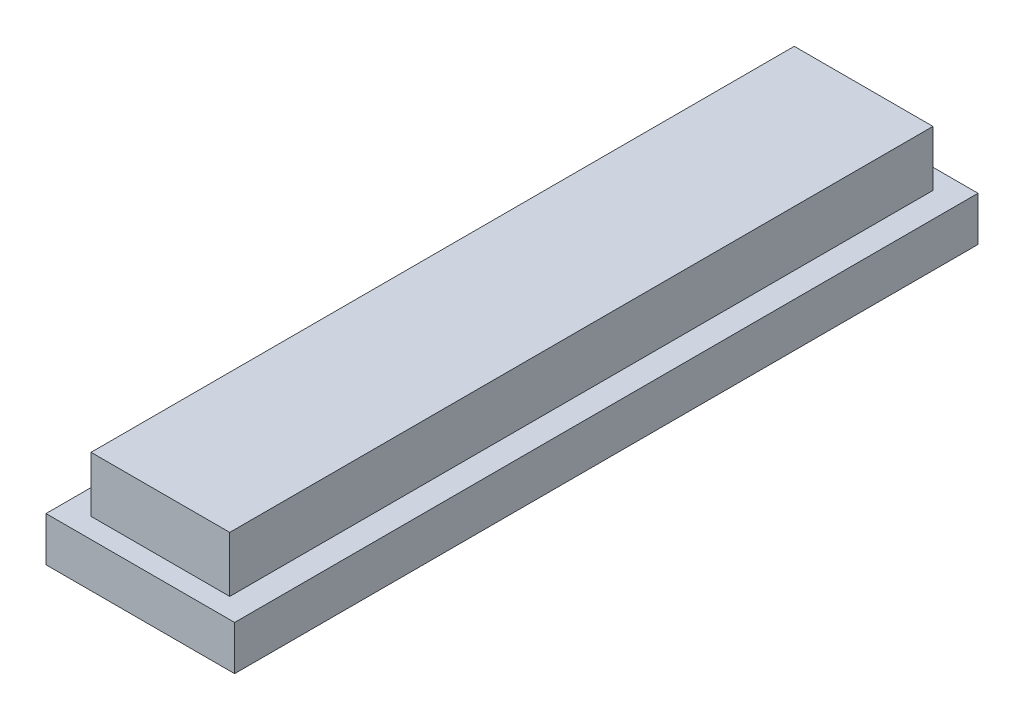
ISO-10303-21;
HEADER;
FILE_DESCRIPTION(('STEP AP214'),'2;1');
FILE_NAME('part.step','',(''),(''),'','','');
FILE_SCHEMA(('AUTOMOTIVE_DESIGN { 1 0 10303 214 1 1 1 1 }'));
ENDSEC;
DATA;
#1=APPLICATION_CONTEXT('core data for automotive mechanical design processes');
#2=APPLICATION_PROTOCOL_DEFINITION('international standard','automotive_design',2000,#1);
#3=PRODUCT_CONTEXT('',#1,'mechanical');
#4=PRODUCT('Part','Part','',(#3));
#5=PRODUCT_RELATED_PRODUCT_CATEGORY('part','',(#4));
#6=PRODUCT_DEFINITION_FORMATION('','',#4);
#7=PRODUCT_DEFINITION_CONTEXT('part definition',#1,'design');
#8=PRODUCT_DEFINITION('design','',#6,#7);
#9=PRODUCT_DEFINITION_SHAPE('','',#8);
#10=(LENGTH_UNIT() NAMED_UNIT(*) SI_UNIT(.MILLI.,.METRE.));
#11=(NAMED_UNIT(*) PLANE_ANGLE_UNIT() SI_UNIT($,.RADIAN.));
#12=(NAMED_UNIT(*) SI_UNIT($,.STERADIAN.) SOLID_ANGLE_UNIT());
#13=UNCERTAINTY_MEASURE_WITH_UNIT(LENGTH_MEASURE(1.E-05),#10,'distance_accuracy_value','');
#14=(GEOMETRIC_REPRESENTATION_CONTEXT(3) GLOBAL_UNCERTAINTY_ASSIGNED_CONTEXT((#13)) GLOBAL_UNIT_ASSIGNED_CONTEXT((#10,
#11,#12)) REPRESENTATION_CONTEXT('',''));
#15=CARTESIAN_POINT('',(0.,0.,0.));
#16=DIRECTION('',(0.,0.,1.));
#17=DIRECTION('',(1.,0.,0.));
#18=AXIS2_PLACEMENT_3D('',#15,#16,#17);
#19=CARTESIAN_POINT('',(0.,4.,0.));
#20=DIRECTION('',(0.,-1.,0.));
#21=DIRECTION('',(0.,0.,-1.));
#22=AXIS2_PLACEMENT_3D('',#19,#20,#21);
#23=PLANE('',#22);
#24=DIRECTION('',(0.,0.,1.));
#25=VECTOR('',#24,1.);
#26=CARTESIAN_POINT('',(-8.5,4.,-33.5));
#27=LINE('',#26,#25);
#28=CARTESIAN_POINT('',(-8.5,4.,-33.5));
#29=VERTEX_POINT('',#28);
#30=CARTESIAN_POINT('',(-8.49999999999999,4.,33.5));
#31=VERTEX_POINT('',#30);
#32=EDGE_CURVE('E141',#29,#31,#27,.T.);
#33=ORIENTED_EDGE('',*,*,#32,.T.);
#34=DIRECTION('',(1.,0.,0.));
#35=VECTOR('',#34,1.);
#36=CARTESIAN_POINT('',(8.50000000000001,4.,33.5));
#37=LINE('',#36,#35);
#38=CARTESIAN_POINT('',(8.50000000000001,4.,33.5));
#39=VERTEX_POINT('',#38);
#40=EDGE_CURVE('E145',#31,#39,#37,.T.);
#41=ORIENTED_EDGE('',*,*,#40,.T.);
#42=DIRECTION('',(0.,0.,-1.));
#43=VECTOR('',#42,1.);
#44=CARTESIAN_POINT('',(8.5,4.,-33.5));
#45=LINE('',#44,#43);
#46=CARTESIAN_POINT('',(8.5,4.,-33.5));
#47=VERTEX_POINT('',#46);
#48=EDGE_CURVE('E149',#39,#47,#45,.T.);
#49=ORIENTED_EDGE('',*,*,#48,.T.);
#50=DIRECTION('',(-1.,0.,0.));
#51=VECTOR('',#50,1.);
#52=CARTESIAN_POINT('',(8.5,4.,-33.5));
#53=LINE('',#52,#51);
#54=EDGE_CURVE('E152',#47,#29,#53,.T.);
#55=ORIENTED_EDGE('',*,*,#54,.T.);
#56=EDGE_LOOP('',(#33,#41,#49,#55));
#57=FACE_BOUND('',#56,.T.);
#58=DIRECTION('',(0.,0.,1.));
#59=VECTOR('',#58,1.);
#60=CARTESIAN_POINT('',(-6.25,4.,-31.69));
#61=LINE('',#60,#59);
#62=CARTESIAN_POINT('',(-6.25,4.,-31.69));
#63=VERTEX_POINT('',#62);
#64=CARTESIAN_POINT('',(-6.25,4.,31.69));
#65=VERTEX_POINT('',#64);
#66=EDGE_CURVE('E57',#63,#65,#61,.T.);
#67=ORIENTED_EDGE('',*,*,#66,.F.);
#68=DIRECTION('',(-1.,0.,0.));
#69=VECTOR('',#68,1.);
#70=CARTESIAN_POINT('',(6.25,4.,-31.69));
#71=LINE('',#70,#69);
#72=CARTESIAN_POINT('',(6.25,4.,-31.69));
#73=VERTEX_POINT('',#72);
#74=EDGE_CURVE('E61',#73,#63,#71,.T.);
#75=ORIENTED_EDGE('',*,*,#74,.F.);
#76=DIRECTION('',(0.,0.,-1.));
#77=VECTOR('',#76,1.);
#78=CARTESIAN_POINT('',(6.25,4.,-31.69));
#79=LINE('',#78,#77);
#80=CARTESIAN_POINT('',(6.25,4.,31.69));
#81=VERTEX_POINT('',#80);
#82=EDGE_CURVE('E226',#81,#73,#79,.T.);
#83=ORIENTED_EDGE('',*,*,#82,.F.);
#84=DIRECTION('',(1.,0.,0.));
#85=VECTOR('',#84,1.);
#86=CARTESIAN_POINT('',(6.25,4.,31.69));
#87=LINE('',#86,#85);
#88=EDGE_CURVE('E223',#65,#81,#87,.T.);
#89=ORIENTED_EDGE('',*,*,#88,.F.);
#90=EDGE_LOOP('',(#67,#75,#83,#89));
#91=FACE_BOUND('',#90,.T.);
#92=ADVANCED_FACE('F39',(#57,#91),#23,.F.);
#93=CARTESIAN_POINT('',(-8.5,4.,-33.5));
#94=DIRECTION('',(1.,0.,0.));
#95=DIRECTION('',(0.,0.,-1.));
#96=AXIS2_PLACEMENT_3D('',#93,#94,#95);
#97=PLANE('',#96);
#98=DIRECTION('',(0.,0.,1.));
#99=VECTOR('',#98,1.);
#100=CARTESIAN_POINT('',(-8.5,0.,-33.5));
#101=LINE('',#100,#99);
#102=CARTESIAN_POINT('',(-8.5,0.,-33.5));
#103=VERTEX_POINT('',#102);
#104=CARTESIAN_POINT('',(-8.49999999999999,0.,33.5));
#105=VERTEX_POINT('',#104);
#106=EDGE_CURVE('E130',#103,#105,#101,.T.);
#107=ORIENTED_EDGE('',*,*,#106,.T.);
#108=DIRECTION('',(0.,-1.,0.));
#109=VECTOR('',#108,1.);
#110=CARTESIAN_POINT('',(-8.49999999999999,4.,33.5));
#111=LINE('',#110,#109);
#112=EDGE_CURVE('E11',#31,#105,#111,.T.);
#113=ORIENTED_EDGE('',*,*,#112,.F.);
#114=ORIENTED_EDGE('',*,*,#32,.F.);
#115=DIRECTION('',(0.,-1.,0.));
#116=VECTOR('',#115,1.);
#117=CARTESIAN_POINT('',(-8.5,4.,-33.5));
#118=LINE('',#117,#116);
#119=EDGE_CURVE('E154',#29,#103,#118,.T.);
#120=ORIENTED_EDGE('',*,*,#119,.T.);
#121=EDGE_LOOP('',(#107,#113,#114,#120));
#122=FACE_BOUND('',#121,.T.);
#123=ADVANCED_FACE('F41',(#122),#97,.F.);
#124=CARTESIAN_POINT('',(8.50000000000001,4.,33.5));
#125=DIRECTION('',(0.,0.,-1.));
#126=DIRECTION('',(-1.,0.,0.));
#127=AXIS2_PLACEMENT_3D('',#124,#125,#126);
#128=PLANE('',#127);
#129=DIRECTION('',(1.,0.,0.));
#130=VECTOR('',#129,1.);
#131=CARTESIAN_POINT('',(8.50000000000001,0.,33.5));
#132=LINE('',#131,#130);
#133=CARTESIAN_POINT('',(8.50000000000001,0.,33.5));
#134=VERTEX_POINT('',#133);
#135=EDGE_CURVE('E135',#105,#134,#132,.T.);
#136=ORIENTED_EDGE('',*,*,#135,.T.);
#137=DIRECTION('',(0.,-1.,0.));
#138=VECTOR('',#137,1.);
#139=CARTESIAN_POINT('',(8.50000000000001,4.,33.5));
#140=LINE('',#139,#138);
#141=EDGE_CURVE('E49',#39,#134,#140,.T.);
#142=ORIENTED_EDGE('',*,*,#141,.F.);
#143=ORIENTED_EDGE('',*,*,#40,.F.);
#144=ORIENTED_EDGE('',*,*,#112,.T.);
#145=EDGE_LOOP('',(#136,#142,#143,#144));
#146=FACE_BOUND('',#145,.T.);
#147=ADVANCED_FACE('F245',(#146),#128,.F.);
#148=CARTESIAN_POINT('',(8.5,4.,-33.5));
#149=DIRECTION('',(-1.,0.,0.));
#150=DIRECTION('',(0.,0.,1.));
#151=AXIS2_PLACEMENT_3D('',#148,#149,#150);
#152=PLANE('',#151);
#153=DIRECTION('',(0.,0.,-1.));
#154=VECTOR('',#153,1.);
#155=CARTESIAN_POINT('',(8.5,0.,-33.5));
#156=LINE('',#155,#154);
#157=CARTESIAN_POINT('',(8.5,0.,-33.5));
#158=VERTEX_POINT('',#157);
#159=EDGE_CURVE('E158',#134,#158,#156,.T.);
#160=ORIENTED_EDGE('',*,*,#159,.T.);
#161=DIRECTION('',(0.,-1.,0.));
#162=VECTOR('',#161,1.);
#163=CARTESIAN_POINT('',(8.5,4.,-33.5));
#164=LINE('',#163,#162);
#165=EDGE_CURVE('E166',#47,#158,#164,.T.);
#166=ORIENTED_EDGE('',*,*,#165,.F.);
#167=ORIENTED_EDGE('',*,*,#48,.F.);
#168=ORIENTED_EDGE('',*,*,#141,.T.);
#169=EDGE_LOOP('',(#160,#166,#167,#168));
#170=FACE_BOUND('',#169,.T.);
#171=ADVANCED_FACE('F257',(#170),#152,.F.);
#172=CARTESIAN_POINT('',(8.5,4.,-33.5));
#173=DIRECTION('',(0.,0.,1.));
#174=DIRECTION('',(1.,0.,0.));
#175=AXIS2_PLACEMENT_3D('',#172,#173,#174);
#176=PLANE('',#175);
#177=DIRECTION('',(-1.,0.,0.));
#178=VECTOR('',#177,1.);
#179=CARTESIAN_POINT('',(8.5,0.,-33.5));
#180=LINE('',#179,#178);
#181=EDGE_CURVE('E146',#158,#103,#180,.T.);
#182=ORIENTED_EDGE('',*,*,#181,.T.);
#183=ORIENTED_EDGE('',*,*,#119,.F.);
#184=ORIENTED_EDGE('',*,*,#54,.F.);
#185=ORIENTED_EDGE('',*,*,#165,.T.);
#186=EDGE_LOOP('',(#182,#183,#184,#185));
#187=FACE_BOUND('',#186,.T.);
#188=ADVANCED_FACE('F253',(#187),#176,.F.);
#189=CARTESIAN_POINT('',(0.,0.,0.));
#190=DIRECTION('',(0.,-1.,0.));
#191=DIRECTION('',(0.,0.,-1.));
#192=AXIS2_PLACEMENT_3D('',#189,#190,#191);
#193=PLANE('',#192);
#194=CARTESIAN_POINT('',(0.000544501566562177,0.,-25.9999999942984));
#195=DIRECTION('',(0.,-1.,0.));
#196=DIRECTION('',(0.,0.,-1.));
#197=AXIS2_PLACEMENT_3D('',#194,#195,#196);
#198=CIRCLE('',#197,3.45);
#199=CARTESIAN_POINT('',(0.000544501566562177,0.,-29.4499999942984));
#200=VERTEX_POINT('',#199);
#201=EDGE_CURVE('E192',#200,#200,#198,.T.);
#202=ORIENTED_EDGE('',*,*,#201,.F.);
#203=EDGE_LOOP('',(#202));
#204=FACE_BOUND('',#203,.T.);
#205=CARTESIAN_POINT('',(0.000272250783281088,0.,-12.9999999971492));
#206=DIRECTION('',(0.,-1.,0.));
#207=DIRECTION('',(0.,0.,-1.));
#208=AXIS2_PLACEMENT_3D('',#205,#206,#207);
#209=CIRCLE('',#208,3.45);
#210=CARTESIAN_POINT('',(0.000272250783281088,0.,-16.4499999971492));
#211=VERTEX_POINT('',#210);
#212=EDGE_CURVE('E203',#211,#211,#209,.T.);
#213=ORIENTED_EDGE('',*,*,#212,.F.);
#214=EDGE_LOOP('',(#213));
#215=FACE_BOUND('',#214,.T.);
#216=CARTESIAN_POINT('',(0.273629758933262,0.,25.9985600900324));
#217=DIRECTION('',(0.,-1.,0.));
#218=DIRECTION('',(0.,0.,-1.));
#219=AXIS2_PLACEMENT_3D('',#216,#217,#218);
#220=CIRCLE('',#219,3.45);
#221=CARTESIAN_POINT('',(0.273629758933262,0.,22.5485600900324));
#222=VERTEX_POINT('',#221);
#223=EDGE_CURVE('E569',#222,#222,#220,.T.);
#224=ORIENTED_EDGE('',*,*,#223,.F.);
#225=EDGE_LOOP('',(#224));
#226=FACE_BOUND('',#225,.T.);
#227=CARTESIAN_POINT('',(0.136814879466631,0.,12.9992800450162));
#228=DIRECTION('',(0.,-1.,0.));
#229=DIRECTION('',(0.,0.,-1.));
#230=AXIS2_PLACEMENT_3D('',#227,#228,#229);
#231=CIRCLE('',#230,3.45);
#232=CARTESIAN_POINT('',(0.136814879466631,0.,9.54928004501621));
#233=VERTEX_POINT('',#232);
#234=EDGE_CURVE('E561',#233,#233,#231,.T.);
#235=ORIENTED_EDGE('',*,*,#234,.F.);
#236=EDGE_LOOP('',(#235));
#237=FACE_BOUND('',#236,.T.);
#238=CARTESIAN_POINT('',(0.,0.,0.));
#239=DIRECTION('',(0.,-1.,0.));
#240=DIRECTION('',(0.,0.,-1.));
#241=AXIS2_PLACEMENT_3D('',#238,#239,#240);
#242=CIRCLE('',#241,3.45);
#243=CARTESIAN_POINT('',(0.,0.,-3.45));
#244=VERTEX_POINT('',#243);
#245=EDGE_CURVE('E211',#244,#244,#242,.T.);
#246=ORIENTED_EDGE('',*,*,#245,.F.);
#247=EDGE_LOOP('',(#246));
#248=FACE_BOUND('',#247,.T.);
#249=ORIENTED_EDGE('',*,*,#106,.F.);
#250=ORIENTED_EDGE('',*,*,#181,.F.);
#251=ORIENTED_EDGE('',*,*,#159,.F.);
#252=ORIENTED_EDGE('',*,*,#135,.F.);
#253=EDGE_LOOP('',(#249,#250,#251,#252));
#254=FACE_BOUND('',#253,.T.);
#255=ADVANCED_FACE('F250',(#204,#215,#226,#237,#248,#254),#193,.T.);
#256=CARTESIAN_POINT('',(-6.25,9.,-31.69));
#257=DIRECTION('',(1.,0.,0.));
#258=DIRECTION('',(0.,0.,-1.));
#259=AXIS2_PLACEMENT_3D('',#256,#257,#258);
#260=PLANE('',#259);
#261=ORIENTED_EDGE('',*,*,#66,.T.);
#262=DIRECTION('',(0.,-1.,0.));
#263=VECTOR('',#262,1.);
#264=CARTESIAN_POINT('',(-6.25,9.,31.69));
#265=LINE('',#264,#263);
#266=CARTESIAN_POINT('',(-6.25,9.,31.69));
#267=VERTEX_POINT('',#266);
#268=EDGE_CURVE('E110',#267,#65,#265,.T.);
#269=ORIENTED_EDGE('',*,*,#268,.F.);
#270=DIRECTION('',(0.,0.,1.));
#271=VECTOR('',#270,1.);
#272=CARTESIAN_POINT('',(-6.25,9.,-31.69));
#273=LINE('',#272,#271);
#274=CARTESIAN_POINT('',(-6.25,9.,-31.69));
#275=VERTEX_POINT('',#274);
#276=EDGE_CURVE('E117',#275,#267,#273,.T.);
#277=ORIENTED_EDGE('',*,*,#276,.F.);
#278=DIRECTION('',(0.,-1.,0.));
#279=VECTOR('',#278,1.);
#280=CARTESIAN_POINT('',(-6.25,9.,-31.69));
#281=LINE('',#280,#279);
#282=EDGE_CURVE('E220',#275,#63,#281,.T.);
#283=ORIENTED_EDGE('',*,*,#282,.T.);
#284=EDGE_LOOP('',(#261,#269,#277,#283));
#285=FACE_BOUND('',#284,.T.);
#286=ADVANCED_FACE('F128',(#285),#260,.F.);
#287=CARTESIAN_POINT('',(6.25,9.,31.69));
#288=DIRECTION('',(0.,0.,-1.));
#289=DIRECTION('',(-1.,0.,0.));
#290=AXIS2_PLACEMENT_3D('',#287,#288,#289);
#291=PLANE('',#290);
#292=ORIENTED_EDGE('',*,*,#88,.T.);
#293=DIRECTION('',(0.,-1.,0.));
#294=VECTOR('',#293,1.);
#295=CARTESIAN_POINT('',(6.25,9.,31.69));
#296=LINE('',#295,#294);
#297=CARTESIAN_POINT('',(6.25,9.,31.69));
#298=VERTEX_POINT('',#297);
#299=EDGE_CURVE('E112',#298,#81,#296,.T.);
#300=ORIENTED_EDGE('',*,*,#299,.F.);
#301=DIRECTION('',(1.,0.,0.));
#302=VECTOR('',#301,1.);
#303=CARTESIAN_POINT('',(6.25,9.,31.69));
#304=LINE('',#303,#302);
#305=EDGE_CURVE('E105',#267,#298,#304,.T.);
#306=ORIENTED_EDGE('',*,*,#305,.F.);
#307=ORIENTED_EDGE('',*,*,#268,.T.);
#308=EDGE_LOOP('',(#292,#300,#306,#307));
#309=FACE_BOUND('',#308,.T.);
#310=ADVANCED_FACE('F108',(#309),#291,.F.);
#311=CARTESIAN_POINT('',(6.25,9.,-31.69));
#312=DIRECTION('',(-1.,0.,0.));
#313=DIRECTION('',(0.,0.,1.));
#314=AXIS2_PLACEMENT_3D('',#311,#312,#313);
#315=PLANE('',#314);
#316=ORIENTED_EDGE('',*,*,#82,.T.);
#317=DIRECTION('',(0.,-1.,0.));
#318=VECTOR('',#317,1.);
#319=CARTESIAN_POINT('',(6.25,9.,-31.69));
#320=LINE('',#319,#318);
#321=CARTESIAN_POINT('',(6.25,9.,-31.69));
#322=VERTEX_POINT('',#321);
#323=EDGE_CURVE('E137',#322,#73,#320,.T.);
#324=ORIENTED_EDGE('',*,*,#323,.F.);
#325=DIRECTION('',(0.,0.,-1.));
#326=VECTOR('',#325,1.);
#327=CARTESIAN_POINT('',(6.25,9.,-31.69));
#328=LINE('',#327,#326);
#329=EDGE_CURVE('E116',#298,#322,#328,.T.);
#330=ORIENTED_EDGE('',*,*,#329,.F.);
#331=ORIENTED_EDGE('',*,*,#299,.T.);
#332=EDGE_LOOP('',(#316,#324,#330,#331));
#333=FACE_BOUND('',#332,.T.);
#334=ADVANCED_FACE('F238',(#333),#315,.F.);
#335=CARTESIAN_POINT('',(6.25,9.,-31.69));
#336=DIRECTION('',(0.,0.,1.));
#337=DIRECTION('',(1.,0.,0.));
#338=AXIS2_PLACEMENT_3D('',#335,#336,#337);
#339=PLANE('',#338);
#340=ORIENTED_EDGE('',*,*,#74,.T.);
#341=ORIENTED_EDGE('',*,*,#282,.F.);
#342=DIRECTION('',(-1.,0.,0.));
#343=VECTOR('',#342,1.);
#344=CARTESIAN_POINT('',(6.25,9.,-31.69));
#345=LINE('',#344,#343);
#346=EDGE_CURVE('E122',#322,#275,#345,.T.);
#347=ORIENTED_EDGE('',*,*,#346,.F.);
#348=ORIENTED_EDGE('',*,*,#323,.T.);
#349=EDGE_LOOP('',(#340,#341,#347,#348));
#350=FACE_BOUND('',#349,.T.);
#351=ADVANCED_FACE('F236',(#350),#339,.F.);
#352=CARTESIAN_POINT('',(0.,9.,0.));
#353=DIRECTION('',(0.,-1.,0.));
#354=DIRECTION('',(0.,0.,-1.));
#355=AXIS2_PLACEMENT_3D('',#352,#353,#354);
#356=PLANE('',#355);
#357=ORIENTED_EDGE('',*,*,#276,.T.);
#358=ORIENTED_EDGE('',*,*,#305,.T.);
#359=ORIENTED_EDGE('',*,*,#329,.T.);
#360=ORIENTED_EDGE('',*,*,#346,.T.);
#361=EDGE_LOOP('',(#357,#358,#359,#360));
#362=FACE_BOUND('',#361,.T.);
#363=ADVANCED_FACE('F120',(#362),#356,.F.);
#364=CARTESIAN_POINT('',(0.,1.,0.));
#365=DIRECTION('',(0.,-1.,0.));
#366=DIRECTION('',(0.,0.,-1.));
#367=AXIS2_PLACEMENT_3D('',#364,#365,#366);
#368=CYLINDRICAL_SURFACE('',#367,3.45);
#369=CARTESIAN_POINT('',(0.,1.,0.));
#370=DIRECTION('',(0.,-1.,0.));
#371=DIRECTION('',(0.,0.,-1.));
#372=AXIS2_PLACEMENT_3D('',#369,#370,#371);
#373=CIRCLE('',#372,3.45);
#374=CARTESIAN_POINT('',(0.,1.,-3.45));
#375=VERTEX_POINT('',#374);
#376=EDGE_CURVE('E207',#375,#375,#373,.T.);
#377=ORIENTED_EDGE('',*,*,#376,.F.);
#378=EDGE_LOOP('',(#377));
#379=FACE_BOUND('',#378,.T.);
#380=ORIENTED_EDGE('',*,*,#245,.T.);
#381=EDGE_LOOP('',(#380));
#382=FACE_BOUND('',#381,.T.);
#383=ADVANCED_FACE('F319',(#379,#382),#368,.F.);
#384=CARTESIAN_POINT('',(0.,1.,0.));
#385=DIRECTION('',(0.,-1.,0.));
#386=DIRECTION('',(0.,0.,-1.));
#387=AXIS2_PLACEMENT_3D('',#384,#385,#386);
#388=PLANE('',#387);
#389=CARTESIAN_POINT('',(0.,1.,0.));
#390=DIRECTION('',(0.,-1.,0.));
#391=DIRECTION('',(0.,0.,-1.));
#392=AXIS2_PLACEMENT_3D('',#389,#390,#391);
#393=CIRCLE('',#392,2.95);
#394=CARTESIAN_POINT('',(0.,1.,-2.95));
#395=VERTEX_POINT('',#394);
#396=EDGE_CURVE('E43',#395,#395,#393,.T.);
#397=ORIENTED_EDGE('',*,*,#396,.F.);
#398=EDGE_LOOP('',(#397));
#399=FACE_BOUND('',#398,.T.);
#400=ORIENTED_EDGE('',*,*,#376,.T.);
#401=EDGE_LOOP('',(#400));
#402=FACE_BOUND('',#401,.T.);
#403=ADVANCED_FACE('F325',(#399,#402),#388,.T.);
#404=CARTESIAN_POINT('',(0.136814879466631,1.,12.9992800450162));
#405=DIRECTION('',(0.,-1.,0.));
#406=DIRECTION('',(0.,0.,-1.));
#407=AXIS2_PLACEMENT_3D('',#404,#405,#406);
#408=CYLINDRICAL_SURFACE('',#407,3.45);
#409=CARTESIAN_POINT('',(0.136814879466631,1.,12.9992800450162));
#410=DIRECTION('',(0.,-1.,0.));
#411=DIRECTION('',(0.,0.,-1.));
#412=AXIS2_PLACEMENT_3D('',#409,#410,#411);
#413=CIRCLE('',#412,3.45);
#414=CARTESIAN_POINT('',(0.136814879466631,1.,9.54928004501621));
#415=VERTEX_POINT('',#414);
#416=EDGE_CURVE('E214',#415,#415,#413,.T.);
#417=ORIENTED_EDGE('',*,*,#416,.F.);
#418=EDGE_LOOP('',(#417));
#419=FACE_BOUND('',#418,.T.);
#420=ORIENTED_EDGE('',*,*,#234,.T.);
#421=EDGE_LOOP('',(#420));
#422=FACE_BOUND('',#421,.T.);
#423=ADVANCED_FACE('F334',(#419,#422),#408,.F.);
#424=CARTESIAN_POINT('',(0.136814879466631,1.,12.9992800450162));
#425=DIRECTION('',(0.,-1.,0.));
#426=DIRECTION('',(0.,0.,-1.));
#427=AXIS2_PLACEMENT_3D('',#424,#425,#426);
#428=PLANE('',#427);
#429=CARTESIAN_POINT('',(0.136814879466631,1.,12.9992800450162));
#430=DIRECTION('',(0.,-1.,0.));
#431=DIRECTION('',(0.,0.,-1.));
#432=AXIS2_PLACEMENT_3D('',#429,#430,#431);
#433=CIRCLE('',#432,2.95);
#434=CARTESIAN_POINT('',(0.136814879466631,1.,10.0492800450162));
#435=VERTEX_POINT('',#434);
#436=EDGE_CURVE('E185',#435,#435,#433,.T.);
#437=ORIENTED_EDGE('',*,*,#436,.F.);
#438=EDGE_LOOP('',(#437));
#439=FACE_BOUND('',#438,.T.);
#440=ORIENTED_EDGE('',*,*,#416,.T.);
#441=EDGE_LOOP('',(#440));
#442=FACE_BOUND('',#441,.T.);
#443=ADVANCED_FACE('F343',(#439,#442),#428,.T.);
#444=CARTESIAN_POINT('',(0.273629758933262,1.,25.9985600900324));
#445=DIRECTION('',(0.,-1.,0.));
#446=DIRECTION('',(0.,0.,-1.));
#447=AXIS2_PLACEMENT_3D('',#444,#445,#446);
#448=CYLINDRICAL_SURFACE('',#447,3.45);
#449=CARTESIAN_POINT('',(0.273629758933262,1.,25.9985600900324));
#450=DIRECTION('',(0.,-1.,0.));
#451=DIRECTION('',(0.,0.,-1.));
#452=AXIS2_PLACEMENT_3D('',#449,#450,#451);
#453=CIRCLE('',#452,3.45);
#454=CARTESIAN_POINT('',(0.273629758933262,1.,22.5485600900324));
#455=VERTEX_POINT('',#454);
#456=EDGE_CURVE('E565',#455,#455,#453,.T.);
#457=ORIENTED_EDGE('',*,*,#456,.F.);
#458=EDGE_LOOP('',(#457));
#459=FACE_BOUND('',#458,.T.);
#460=ORIENTED_EDGE('',*,*,#223,.T.);
#461=EDGE_LOOP('',(#460));
#462=FACE_BOUND('',#461,.T.);
#463=ADVANCED_FACE('F351',(#459,#462),#448,.F.);
#464=CARTESIAN_POINT('',(0.273629758933262,1.,25.9985600900324));
#465=DIRECTION('',(0.,-1.,0.));
#466=DIRECTION('',(0.,0.,-1.));
#467=AXIS2_PLACEMENT_3D('',#464,#465,#466);
#468=PLANE('',#467);
#469=CARTESIAN_POINT('',(0.273629758933262,1.,25.9985600900324));
#470=DIRECTION('',(0.,-1.,0.));
#471=DIRECTION('',(0.,0.,-1.));
#472=AXIS2_PLACEMENT_3D('',#469,#470,#471);
#473=CIRCLE('',#472,2.95);
#474=CARTESIAN_POINT('',(0.273629758933262,1.,23.0485600900324));
#475=VERTEX_POINT('',#474);
#476=EDGE_CURVE('E182',#475,#475,#473,.T.);
#477=ORIENTED_EDGE('',*,*,#476,.F.);
#478=EDGE_LOOP('',(#477));
#479=FACE_BOUND('',#478,.T.);
#480=ORIENTED_EDGE('',*,*,#456,.T.);
#481=EDGE_LOOP('',(#480));
#482=FACE_BOUND('',#481,.T.);
#483=ADVANCED_FACE('F359',(#479,#482),#468,.T.);
#484=CARTESIAN_POINT('',(0.000272250783281088,1.,-12.9999999971492));
#485=DIRECTION('',(0.,-1.,0.));
#486=DIRECTION('',(0.,0.,-1.));
#487=AXIS2_PLACEMENT_3D('',#484,#485,#486);
#488=CYLINDRICAL_SURFACE('',#487,3.45);
#489=CARTESIAN_POINT('',(0.000272250783281088,1.,-12.9999999971492));
#490=DIRECTION('',(0.,-1.,0.));
#491=DIRECTION('',(0.,0.,-1.));
#492=AXIS2_PLACEMENT_3D('',#489,#490,#491);
#493=CIRCLE('',#492,3.45);
#494=CARTESIAN_POINT('',(0.000272250783281088,1.,-16.4499999971492));
#495=VERTEX_POINT('',#494);
#496=EDGE_CURVE('E573',#495,#495,#493,.T.);
#497=ORIENTED_EDGE('',*,*,#496,.F.);
#498=EDGE_LOOP('',(#497));
#499=FACE_BOUND('',#498,.T.);
#500=ORIENTED_EDGE('',*,*,#212,.T.);
#501=EDGE_LOOP('',(#500));
#502=FACE_BOUND('',#501,.T.);
#503=ADVANCED_FACE('F367',(#499,#502),#488,.F.);
#504=CARTESIAN_POINT('',(0.000272250783281088,1.,-12.9999999971492));
#505=DIRECTION('',(0.,-1.,0.));
#506=DIRECTION('',(0.,0.,-1.));
#507=AXIS2_PLACEMENT_3D('',#504,#505,#506);
#508=PLANE('',#507);
#509=CARTESIAN_POINT('',(0.00027225078346583,1.,-12.9999999971492));
#510=DIRECTION('',(0.,-1.,0.));
#511=DIRECTION('',(0.,0.,-1.));
#512=AXIS2_PLACEMENT_3D('',#509,#510,#511);
#513=CIRCLE('',#512,2.95);
#514=CARTESIAN_POINT('',(0.00027225078346583,1.,-15.9499999971492));
#515=VERTEX_POINT('',#514);
#516=EDGE_CURVE('E177',#515,#515,#513,.T.);
#517=ORIENTED_EDGE('',*,*,#516,.F.);
#518=EDGE_LOOP('',(#517));
#519=FACE_BOUND('',#518,.T.);
#520=ORIENTED_EDGE('',*,*,#496,.T.);
#521=EDGE_LOOP('',(#520));
#522=FACE_BOUND('',#521,.T.);
#523=ADVANCED_FACE('F375',(#519,#522),#508,.T.);
#524=CARTESIAN_POINT('',(0.000544501566562177,1.,-25.9999999942984));
#525=DIRECTION('',(0.,-1.,0.));
#526=DIRECTION('',(0.,0.,-1.));
#527=AXIS2_PLACEMENT_3D('',#524,#525,#526);
#528=CYLINDRICAL_SURFACE('',#527,3.45);
#529=CARTESIAN_POINT('',(0.000544501566562177,1.,-25.9999999942984));
#530=DIRECTION('',(0.,-1.,0.));
#531=DIRECTION('',(0.,0.,-1.));
#532=AXIS2_PLACEMENT_3D('',#529,#530,#531);
#533=CIRCLE('',#532,3.45);
#534=CARTESIAN_POINT('',(0.000544501566562177,1.,-29.4499999942984));
#535=VERTEX_POINT('',#534);
#536=EDGE_CURVE('E197',#535,#535,#533,.T.);
#537=ORIENTED_EDGE('',*,*,#536,.F.);
#538=EDGE_LOOP('',(#537));
#539=FACE_BOUND('',#538,.T.);
#540=ORIENTED_EDGE('',*,*,#201,.T.);
#541=EDGE_LOOP('',(#540));
#542=FACE_BOUND('',#541,.T.);
#543=ADVANCED_FACE('F382',(#539,#542),#528,.F.);
#544=CARTESIAN_POINT('',(0.000544501566562177,1.,-25.9999999942984));
#545=DIRECTION('',(0.,-1.,0.));
#546=DIRECTION('',(0.,0.,-1.));
#547=AXIS2_PLACEMENT_3D('',#544,#545,#546);
#548=PLANE('',#547);
#549=CARTESIAN_POINT('',(0.000544501566931659,1.,-25.9999999942984));
#550=DIRECTION('',(0.,-1.,0.));
#551=DIRECTION('',(0.,0.,-1.));
#552=AXIS2_PLACEMENT_3D('',#549,#550,#551);
#553=CIRCLE('',#552,2.95);
#554=CARTESIAN_POINT('',(0.000544501566931659,1.,-28.9499999942984));
#555=VERTEX_POINT('',#554);
#556=EDGE_CURVE('E173',#555,#555,#553,.T.);
#557=ORIENTED_EDGE('',*,*,#556,.F.);
#558=EDGE_LOOP('',(#557));
#559=FACE_BOUND('',#558,.T.);
#560=ORIENTED_EDGE('',*,*,#536,.T.);
#561=EDGE_LOOP('',(#560));
#562=FACE_BOUND('',#561,.T.);
#563=ADVANCED_FACE('F390',(#559,#562),#548,.T.);
#564=CARTESIAN_POINT('',(0.000544501566931659,7.5,-25.9999999942984));
#565=DIRECTION('',(0.,-1.,0.));
#566=DIRECTION('',(0.,0.,-1.));
#567=AXIS2_PLACEMENT_3D('',#564,#565,#566);
#568=CYLINDRICAL_SURFACE('',#567,2.95);
#569=ORIENTED_EDGE('',*,*,#556,.T.);
#570=EDGE_LOOP('',(#569));
#571=FACE_BOUND('',#570,.T.);
#572=CARTESIAN_POINT('',(0.000544501566931659,7.5,-25.9999999942984));
#573=DIRECTION('',(0.,-1.,0.));
#574=DIRECTION('',(0.,0.,-1.));
#575=AXIS2_PLACEMENT_3D('',#572,#573,#574);
#576=CIRCLE('',#575,2.95);
#577=CARTESIAN_POINT('',(0.000544501566931659,7.5,-28.9499999942984));
#578=VERTEX_POINT('',#577);
#579=EDGE_CURVE('E556',#578,#578,#576,.T.);
#580=ORIENTED_EDGE('',*,*,#579,.F.);
#581=EDGE_LOOP('',(#580));
#582=FACE_BOUND('',#581,.T.);
#583=ADVANCED_FACE('F397',(#571,#582),#568,.F.);
#584=CARTESIAN_POINT('',(0.000544501566931659,7.5,-25.9999999942984));
#585=DIRECTION('',(0.,-1.,0.));
#586=DIRECTION('',(0.,0.,-1.));
#587=AXIS2_PLACEMENT_3D('',#584,#585,#586);
#588=PLANE('',#587);
#589=ORIENTED_EDGE('',*,*,#579,.T.);
#590=EDGE_LOOP('',(#589));
#591=FACE_BOUND('',#590,.T.);
#592=ADVANCED_FACE('F405',(#591),#588,.T.);
#593=CARTESIAN_POINT('',(0.00027225078346583,7.5,-12.9999999971492));
#594=DIRECTION('',(0.,-1.,0.));
#595=DIRECTION('',(0.,0.,-1.));
#596=AXIS2_PLACEMENT_3D('',#593,#594,#595);
#597=CYLINDRICAL_SURFACE('',#596,2.95);
#598=ORIENTED_EDGE('',*,*,#516,.T.);
#599=EDGE_LOOP('',(#598));
#600=FACE_BOUND('',#599,.T.);
#601=CARTESIAN_POINT('',(0.00027225078346583,7.5,-12.9999999971492));
#602=DIRECTION('',(0.,-1.,0.));
#603=DIRECTION('',(0.,0.,-1.));
#604=AXIS2_PLACEMENT_3D('',#601,#602,#603);
#605=CIRCLE('',#604,2.95);
#606=CARTESIAN_POINT('',(0.00027225078346583,7.5,-15.9499999971492));
#607=VERTEX_POINT('',#606);
#608=EDGE_CURVE('E598',#607,#607,#605,.T.);
#609=ORIENTED_EDGE('',*,*,#608,.F.);
#610=EDGE_LOOP('',(#609));
#611=FACE_BOUND('',#610,.T.);
#612=ADVANCED_FACE('F413',(#600,#611),#597,.F.);
#613=CARTESIAN_POINT('',(0.00027225078346583,7.5,-12.9999999971492));
#614=DIRECTION('',(0.,-1.,0.));
#615=DIRECTION('',(0.,0.,-1.));
#616=AXIS2_PLACEMENT_3D('',#613,#614,#615);
#617=PLANE('',#616);
#618=ORIENTED_EDGE('',*,*,#608,.T.);
#619=EDGE_LOOP('',(#618));
#620=FACE_BOUND('',#619,.T.);
#621=ADVANCED_FACE('F421',(#620),#617,.T.);
#622=CARTESIAN_POINT('',(0.273629758933262,7.5,25.9985600900324));
#623=DIRECTION('',(0.,-1.,0.));
#624=DIRECTION('',(0.,0.,-1.));
#625=AXIS2_PLACEMENT_3D('',#622,#623,#624);
#626=CYLINDRICAL_SURFACE('',#625,2.95);
#627=ORIENTED_EDGE('',*,*,#476,.T.);
#628=EDGE_LOOP('',(#627));
#629=FACE_BOUND('',#628,.T.);
#630=CARTESIAN_POINT('',(0.273629758933262,7.5,25.9985600900324));
#631=DIRECTION('',(0.,-1.,0.));
#632=DIRECTION('',(0.,0.,-1.));
#633=AXIS2_PLACEMENT_3D('',#630,#631,#632);
#634=CIRCLE('',#633,2.95);
#635=CARTESIAN_POINT('',(0.273629758933262,7.5,23.0485600900324));
#636=VERTEX_POINT('',#635);
#637=EDGE_CURVE('E552',#636,#636,#634,.T.);
#638=ORIENTED_EDGE('',*,*,#637,.F.);
#639=EDGE_LOOP('',(#638));
#640=FACE_BOUND('',#639,.T.);
#641=ADVANCED_FACE('F429',(#629,#640),#626,.F.);
#642=CARTESIAN_POINT('',(0.273629758933262,7.5,25.9985600900324));
#643=DIRECTION('',(0.,-1.,0.));
#644=DIRECTION('',(0.,0.,-1.));
#645=AXIS2_PLACEMENT_3D('',#642,#643,#644);
#646=PLANE('',#645);
#647=ORIENTED_EDGE('',*,*,#637,.T.);
#648=EDGE_LOOP('',(#647));
#649=FACE_BOUND('',#648,.T.);
#650=ADVANCED_FACE('F437',(#649),#646,.T.);
#651=CARTESIAN_POINT('',(0.136814879466631,7.5,12.9992800450162));
#652=DIRECTION('',(0.,-1.,0.));
#653=DIRECTION('',(0.,0.,-1.));
#654=AXIS2_PLACEMENT_3D('',#651,#652,#653);
#655=CYLINDRICAL_SURFACE('',#654,2.95);
#656=ORIENTED_EDGE('',*,*,#436,.T.);
#657=EDGE_LOOP('',(#656));
#658=FACE_BOUND('',#657,.T.);
#659=CARTESIAN_POINT('',(0.136814879466631,7.5,12.9992800450162));
#660=DIRECTION('',(0.,-1.,0.));
#661=DIRECTION('',(0.,0.,-1.));
#662=AXIS2_PLACEMENT_3D('',#659,#660,#661);
#663=CIRCLE('',#662,2.95);
#664=CARTESIAN_POINT('',(0.136814879466631,7.5,10.0492800450162));
#665=VERTEX_POINT('',#664);
#666=EDGE_CURVE('E548',#665,#665,#663,.T.);
#667=ORIENTED_EDGE('',*,*,#666,.F.);
#668=EDGE_LOOP('',(#667));
#669=FACE_BOUND('',#668,.T.);
#670=ADVANCED_FACE('F445',(#658,#669),#655,.F.);
#671=CARTESIAN_POINT('',(0.136814879466631,7.5,12.9992800450162));
#672=DIRECTION('',(0.,-1.,0.));
#673=DIRECTION('',(0.,0.,-1.));
#674=AXIS2_PLACEMENT_3D('',#671,#672,#673);
#675=PLANE('',#674);
#676=ORIENTED_EDGE('',*,*,#666,.T.);
#677=EDGE_LOOP('',(#676));
#678=FACE_BOUND('',#677,.T.);
#679=ADVANCED_FACE('F453',(#678),#675,.T.);
#680=CARTESIAN_POINT('',(0.,7.5,0.));
#681=DIRECTION('',(0.,-1.,0.));
#682=DIRECTION('',(0.,0.,-1.));
#683=AXIS2_PLACEMENT_3D('',#680,#681,#682);
#684=CYLINDRICAL_SURFACE('',#683,2.95);
#685=ORIENTED_EDGE('',*,*,#396,.T.);
#686=EDGE_LOOP('',(#685));
#687=FACE_BOUND('',#686,.T.);
#688=CARTESIAN_POINT('',(0.,7.5,0.));
#689=DIRECTION('',(0.,-1.,0.));
#690=DIRECTION('',(0.,0.,-1.));
#691=AXIS2_PLACEMENT_3D('',#688,#689,#690);
#692=CIRCLE('',#691,2.95);
#693=CARTESIAN_POINT('',(0.,7.5,-2.95));
#694=VERTEX_POINT('',#693);
#695=EDGE_CURVE('E178',#694,#694,#692,.T.);
#696=ORIENTED_EDGE('',*,*,#695,.F.);
#697=EDGE_LOOP('',(#696));
#698=FACE_BOUND('',#697,.T.);
#699=ADVANCED_FACE('F460',(#687,#698),#684,.F.);
#700=CARTESIAN_POINT('',(0.,7.5,0.));
#701=DIRECTION('',(0.,-1.,0.));
#702=DIRECTION('',(0.,0.,-1.));
#703=AXIS2_PLACEMENT_3D('',#700,#701,#702);
#704=PLANE('',#703);
#705=ORIENTED_EDGE('',*,*,#695,.T.);
#706=EDGE_LOOP('',(#705));
#707=FACE_BOUND('',#706,.T.);
#708=ADVANCED_FACE('F468',(#707),#704,.T.);
#709=CLOSED_SHELL('',(#92,#123,#147,#171,#188,#255,#286,#310,#334,#351,#363,#383,#403,#423,#443,
#463,#483,#503,#523,#543,#563,#583,#592,#612,#621,#641,#650,#670,#679,#699,#708));
#710=MANIFOLD_SOLID_BREP('B2',#709);
#711=ADVANCED_BREP_SHAPE_REPRESENTATION('',(#18,#710),#14);
#712=SHAPE_DEFINITION_REPRESENTATION(#9,#711);
ENDSEC;
END-ISO-10303-21;
